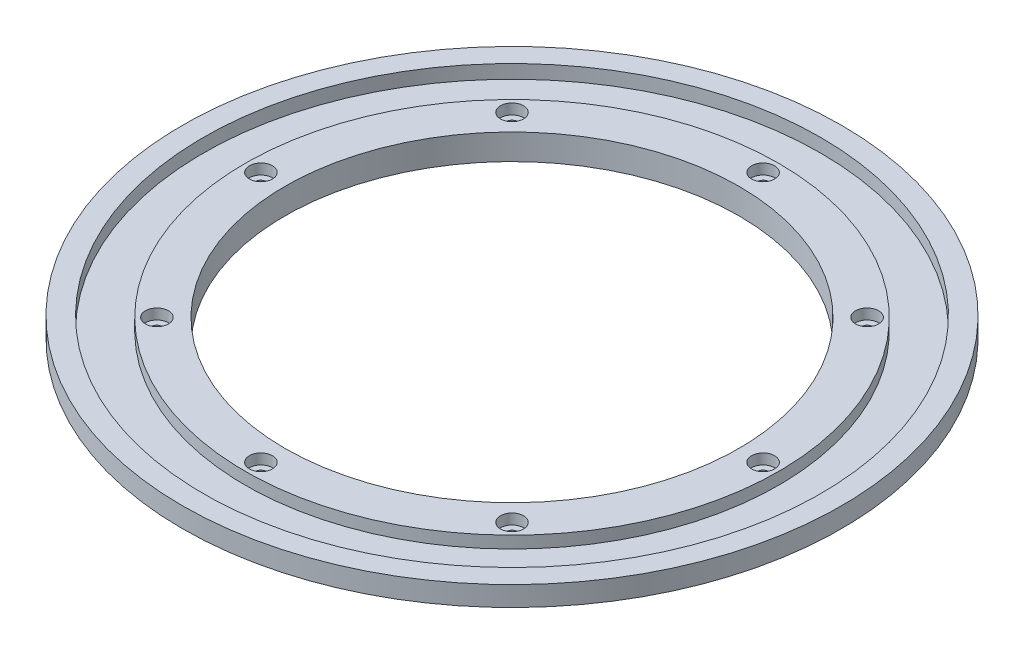
ISO-10303-21;
HEADER;
FILE_DESCRIPTION(('STEP AP214'),'2;1');
FILE_NAME('part.step','',(''),(''),'','','');
FILE_SCHEMA(('AUTOMOTIVE_DESIGN { 1 0 10303 214 1 1 1 1 }'));
ENDSEC;
DATA;
#1=APPLICATION_CONTEXT('core data for automotive mechanical design processes');
#2=APPLICATION_PROTOCOL_DEFINITION('international standard','automotive_design',2000,#1);
#3=PRODUCT_CONTEXT('',#1,'mechanical');
#4=PRODUCT('Part','Part','',(#3));
#5=PRODUCT_RELATED_PRODUCT_CATEGORY('part','',(#4));
#6=PRODUCT_DEFINITION_FORMATION('','',#4);
#7=PRODUCT_DEFINITION_CONTEXT('part definition',#1,'design');
#8=PRODUCT_DEFINITION('design','',#6,#7);
#9=PRODUCT_DEFINITION_SHAPE('','',#8);
#10=(LENGTH_UNIT() NAMED_UNIT(*) SI_UNIT(.MILLI.,.METRE.));
#11=(NAMED_UNIT(*) PLANE_ANGLE_UNIT() SI_UNIT($,.RADIAN.));
#12=(NAMED_UNIT(*) SI_UNIT($,.STERADIAN.) SOLID_ANGLE_UNIT());
#13=UNCERTAINTY_MEASURE_WITH_UNIT(LENGTH_MEASURE(1.E-05),#10,'distance_accuracy_value','');
#14=(GEOMETRIC_REPRESENTATION_CONTEXT(3) GLOBAL_UNCERTAINTY_ASSIGNED_CONTEXT((#13)) GLOBAL_UNIT_ASSIGNED_CONTEXT((#10,
#11,#12)) REPRESENTATION_CONTEXT('',''));
#15=CARTESIAN_POINT('',(0.,0.,0.));
#16=DIRECTION('',(0.,0.,1.));
#17=DIRECTION('',(1.,0.,0.));
#18=AXIS2_PLACEMENT_3D('',#15,#16,#17);
#19=CARTESIAN_POINT('',(-169.705627484764,8.71232876712426,-169.705627484752));
#20=DIRECTION('',(0.,1.,0.));
#21=DIRECTION('',(0.,0.,1.));
#22=AXIS2_PLACEMENT_3D('',#19,#20,#21);
#23=CYLINDRICAL_SURFACE('',#22,4.99999999999999);
#24=CARTESIAN_POINT('',(-169.705627484764,15.7123287671248,-169.705627484752));
#25=DIRECTION('',(0.,1.,0.));
#26=DIRECTION('',(0.,0.,1.));
#27=AXIS2_PLACEMENT_3D('',#24,#25,#26);
#28=CIRCLE('',#27,4.99999999999999);
#29=CARTESIAN_POINT('',(-169.705627484764,15.7123287671248,-164.705627484752));
#30=VERTEX_POINT('',#29);
#31=EDGE_CURVE('E56',#30,#30,#28,.T.);
#32=ORIENTED_EDGE('',*,*,#31,.F.);
#33=EDGE_LOOP('',(#32));
#34=FACE_BOUND('',#33,.T.);
#35=CARTESIAN_POINT('',(-169.705627484764,23.2123287671247,-169.705627484752));
#36=DIRECTION('',(0.,1.,0.));
#37=DIRECTION('',(0.,0.,1.));
#38=AXIS2_PLACEMENT_3D('',#35,#36,#37);
#39=CIRCLE('',#38,4.99999999999999);
#40=CARTESIAN_POINT('',(-169.705627484764,23.2123287671246,-164.705627484752));
#41=VERTEX_POINT('',#40);
#42=EDGE_CURVE('E41',#41,#41,#39,.F.);
#43=ORIENTED_EDGE('',*,*,#42,.F.);
#44=EDGE_LOOP('',(#43));
#45=FACE_BOUND('',#44,.T.);
#46=ADVANCED_FACE('F37',(#34,#45),#23,.F.);
#47=CARTESIAN_POINT('',(-239.999999999973,8.71232876712368,2.67328212068205E-11));
#48=DIRECTION('',(0.,1.,0.));
#49=DIRECTION('',(0.,0.,1.));
#50=AXIS2_PLACEMENT_3D('',#47,#48,#49);
#51=CYLINDRICAL_SURFACE('',#50,4.99999999999999);
#52=CARTESIAN_POINT('',(-239.999999999973,15.7123287671242,2.67568329498127E-11));
#53=DIRECTION('',(0.,1.,0.));
#54=DIRECTION('',(0.,0.,1.));
#55=AXIS2_PLACEMENT_3D('',#52,#53,#54);
#56=CIRCLE('',#55,4.99999999999999);
#57=CARTESIAN_POINT('',(-239.999999999973,15.7123287671242,5.00000000002675));
#58=VERTEX_POINT('',#57);
#59=EDGE_CURVE('E60',#58,#58,#56,.T.);
#60=ORIENTED_EDGE('',*,*,#59,.F.);
#61=EDGE_LOOP('',(#60));
#62=FACE_BOUND('',#61,.T.);
#63=CARTESIAN_POINT('',(-239.999999999973,23.2123287671241,2.67825598173044E-11));
#64=DIRECTION('',(0.,1.,0.));
#65=DIRECTION('',(0.,0.,1.));
#66=AXIS2_PLACEMENT_3D('',#63,#64,#65);
#67=CIRCLE('',#66,4.99999999999999);
#68=CARTESIAN_POINT('',(-239.999999999973,23.2123287671241,5.00000000002677));
#69=VERTEX_POINT('',#68);
#70=EDGE_CURVE('E113',#69,#69,#67,.F.);
#71=ORIENTED_EDGE('',*,*,#70,.F.);
#72=EDGE_LOOP('',(#71));
#73=FACE_BOUND('',#72,.T.);
#74=ADVANCED_FACE('F125',(#62,#73),#51,.F.);
#75=CARTESIAN_POINT('',(-169.705627484726,8.7123287671231,169.70562748479));
#76=DIRECTION('',(0.,1.,0.));
#77=DIRECTION('',(0.,0.,1.));
#78=AXIS2_PLACEMENT_3D('',#75,#76,#77);
#79=CYLINDRICAL_SURFACE('',#78,4.99999999999999);
#80=CARTESIAN_POINT('',(-169.705627484726,15.7123287671236,169.70562748479));
#81=DIRECTION('',(0.,1.,0.));
#82=DIRECTION('',(0.,0.,1.));
#83=AXIS2_PLACEMENT_3D('',#80,#81,#82);
#84=CIRCLE('',#83,4.99999999999999);
#85=CARTESIAN_POINT('',(-169.705627484726,15.7123287671236,174.70562748479));
#86=VERTEX_POINT('',#85);
#87=EDGE_CURVE('E64',#86,#86,#84,.T.);
#88=ORIENTED_EDGE('',*,*,#87,.F.);
#89=EDGE_LOOP('',(#88));
#90=FACE_BOUND('',#89,.T.);
#91=CARTESIAN_POINT('',(-169.705627484726,23.2123287671235,169.70562748479));
#92=DIRECTION('',(0.,1.,0.));
#93=DIRECTION('',(0.,0.,1.));
#94=AXIS2_PLACEMENT_3D('',#91,#92,#93);
#95=CIRCLE('',#94,4.99999999999999);
#96=CARTESIAN_POINT('',(-169.705627484726,23.2123287671235,174.70562748479));
#97=VERTEX_POINT('',#96);
#98=EDGE_CURVE('E110',#97,#97,#95,.F.);
#99=ORIENTED_EDGE('',*,*,#98,.F.);
#100=EDGE_LOOP('',(#99));
#101=FACE_BOUND('',#100,.T.);
#102=ADVANCED_FACE('F131',(#90,#101),#79,.F.);
#103=CARTESIAN_POINT('',(5.33470884532192E-11,8.71232876712285,240.));
#104=DIRECTION('',(0.,1.,0.));
#105=DIRECTION('',(0.,0.,1.));
#106=AXIS2_PLACEMENT_3D('',#103,#104,#105);
#107=CYLINDRICAL_SURFACE('',#106,5.);
#108=CARTESIAN_POINT('',(5.33470884532192E-11,15.7123287671234,240.));
#109=DIRECTION('',(0.,1.,0.));
#110=DIRECTION('',(0.,0.,1.));
#111=AXIS2_PLACEMENT_3D('',#108,#109,#110);
#112=CIRCLE('',#111,5.);
#113=CARTESIAN_POINT('',(5.33470884532192E-11,15.7123287671234,245.));
#114=VERTEX_POINT('',#113);
#115=EDGE_CURVE('E68',#114,#114,#112,.T.);
#116=ORIENTED_EDGE('',*,*,#115,.F.);
#117=EDGE_LOOP('',(#116));
#118=FACE_BOUND('',#117,.T.);
#119=CARTESIAN_POINT('',(5.33470884532192E-11,23.2123287671233,240.));
#120=DIRECTION('',(0.,1.,0.));
#121=DIRECTION('',(0.,0.,1.));
#122=AXIS2_PLACEMENT_3D('',#119,#120,#121);
#123=CIRCLE('',#122,5.);
#124=CARTESIAN_POINT('',(5.33470884532192E-11,23.2123287671232,245.));
#125=VERTEX_POINT('',#124);
#126=EDGE_CURVE('E106',#125,#125,#123,.F.);
#127=ORIENTED_EDGE('',*,*,#126,.F.);
#128=EDGE_LOOP('',(#127));
#129=FACE_BOUND('',#128,.T.);
#130=ADVANCED_FACE('F339',(#118,#129),#107,.F.);
#131=CARTESIAN_POINT('',(169.705627484817,8.7123287671231,169.705627484753));
#132=DIRECTION('',(0.,1.,0.));
#133=DIRECTION('',(0.,0.,1.));
#134=AXIS2_PLACEMENT_3D('',#131,#132,#133);
#135=CYLINDRICAL_SURFACE('',#134,4.99999999999999);
#136=CARTESIAN_POINT('',(169.705627484817,15.7123287671236,169.705627484753));
#137=DIRECTION('',(0.,1.,0.));
#138=DIRECTION('',(0.,0.,1.));
#139=AXIS2_PLACEMENT_3D('',#136,#137,#138);
#140=CIRCLE('',#139,4.99999999999999);
#141=CARTESIAN_POINT('',(169.705627484817,15.7123287671236,174.705627484753));
#142=VERTEX_POINT('',#141);
#143=EDGE_CURVE('E72',#142,#142,#140,.T.);
#144=ORIENTED_EDGE('',*,*,#143,.F.);
#145=EDGE_LOOP('',(#144));
#146=FACE_BOUND('',#145,.T.);
#147=CARTESIAN_POINT('',(169.705627484817,23.2123287671235,169.705627484753));
#148=DIRECTION('',(0.,1.,0.));
#149=DIRECTION('',(0.,0.,1.));
#150=AXIS2_PLACEMENT_3D('',#147,#148,#149);
#151=CIRCLE('',#150,4.99999999999999);
#152=CARTESIAN_POINT('',(169.705627484817,23.2123287671235,174.705627484753));
#153=VERTEX_POINT('',#152);
#154=EDGE_CURVE('E102',#153,#153,#151,.F.);
#155=ORIENTED_EDGE('',*,*,#154,.F.);
#156=EDGE_LOOP('',(#155));
#157=FACE_BOUND('',#156,.T.);
#158=ADVANCED_FACE('F335',(#146,#157),#135,.F.);
#159=CARTESIAN_POINT('',(240.000000000027,8.71232876712368,-2.66436587695782E-11));
#160=DIRECTION('',(0.,1.,0.));
#161=DIRECTION('',(0.,0.,1.));
#162=AXIS2_PLACEMENT_3D('',#159,#160,#161);
#163=CYLINDRICAL_SURFACE('',#162,4.99999999999999);
#164=CARTESIAN_POINT('',(240.000000000027,15.7123287671242,-2.6619647026586E-11));
#165=DIRECTION('',(0.,1.,0.));
#166=DIRECTION('',(0.,0.,1.));
#167=AXIS2_PLACEMENT_3D('',#164,#165,#166);
#168=CIRCLE('',#167,4.99999999999999);
#169=CARTESIAN_POINT('',(240.000000000027,15.7123287671242,4.99999999997337));
#170=VERTEX_POINT('',#169);
#171=EDGE_CURVE('E76',#170,#170,#168,.T.);
#172=ORIENTED_EDGE('',*,*,#171,.F.);
#173=EDGE_LOOP('',(#172));
#174=FACE_BOUND('',#173,.T.);
#175=CARTESIAN_POINT('',(240.000000000027,23.2123287671241,-2.65939201590944E-11));
#176=DIRECTION('',(0.,1.,0.));
#177=DIRECTION('',(0.,0.,1.));
#178=AXIS2_PLACEMENT_3D('',#175,#176,#177);
#179=CIRCLE('',#178,4.99999999999999);
#180=CARTESIAN_POINT('',(240.000000000027,23.2123287671241,4.9999999999734));
#181=VERTEX_POINT('',#180);
#182=EDGE_CURVE('E98',#181,#181,#179,.F.);
#183=ORIENTED_EDGE('',*,*,#182,.F.);
#184=EDGE_LOOP('',(#183));
#185=FACE_BOUND('',#184,.T.);
#186=ADVANCED_FACE('F331',(#174,#185),#163,.F.);
#187=CARTESIAN_POINT('',(169.705627484779,8.71232876712426,-169.70562748479));
#188=DIRECTION('',(0.,1.,0.));
#189=DIRECTION('',(0.,0.,1.));
#190=AXIS2_PLACEMENT_3D('',#187,#188,#189);
#191=CYLINDRICAL_SURFACE('',#190,4.99999999999999);
#192=CARTESIAN_POINT('',(169.705627484779,15.7123287671248,-169.70562748479));
#193=DIRECTION('',(0.,1.,0.));
#194=DIRECTION('',(0.,0.,1.));
#195=AXIS2_PLACEMENT_3D('',#192,#193,#194);
#196=CIRCLE('',#195,4.99999999999999);
#197=CARTESIAN_POINT('',(169.705627484779,15.7123287671248,-164.70562748479));
#198=VERTEX_POINT('',#197);
#199=EDGE_CURVE('E80',#198,#198,#196,.T.);
#200=ORIENTED_EDGE('',*,*,#199,.F.);
#201=EDGE_LOOP('',(#200));
#202=FACE_BOUND('',#201,.T.);
#203=CARTESIAN_POINT('',(169.705627484779,23.2123287671247,-169.70562748479));
#204=DIRECTION('',(0.,1.,0.));
#205=DIRECTION('',(0.,0.,1.));
#206=AXIS2_PLACEMENT_3D('',#203,#204,#205);
#207=CIRCLE('',#206,4.99999999999999);
#208=CARTESIAN_POINT('',(169.705627484779,23.2123287671246,-164.70562748479));
#209=VERTEX_POINT('',#208);
#210=EDGE_CURVE('E93',#209,#209,#207,.F.);
#211=ORIENTED_EDGE('',*,*,#210,.F.);
#212=EDGE_LOOP('',(#211));
#213=FACE_BOUND('',#212,.T.);
#214=ADVANCED_FACE('F327',(#202,#213),#191,.F.);
#215=CARTESIAN_POINT('',(0.,8.7123287671245,-240.));
#216=DIRECTION('',(0.,1.,0.));
#217=DIRECTION('',(0.,0.,1.));
#218=AXIS2_PLACEMENT_3D('',#215,#216,#217);
#219=CYLINDRICAL_SURFACE('',#218,5.);
#220=CARTESIAN_POINT('',(0.,15.712328767125,-240.));
#221=DIRECTION('',(0.,1.,0.));
#222=DIRECTION('',(0.,0.,1.));
#223=AXIS2_PLACEMENT_3D('',#220,#221,#222);
#224=CIRCLE('',#223,5.);
#225=CARTESIAN_POINT('',(0.,15.712328767125,-235.));
#226=VERTEX_POINT('',#225);
#227=EDGE_CURVE('E84',#226,#226,#224,.T.);
#228=ORIENTED_EDGE('',*,*,#227,.F.);
#229=EDGE_LOOP('',(#228));
#230=FACE_BOUND('',#229,.T.);
#231=CARTESIAN_POINT('',(0.,23.2123287671249,-240.));
#232=DIRECTION('',(0.,1.,0.));
#233=DIRECTION('',(0.,0.,1.));
#234=AXIS2_PLACEMENT_3D('',#231,#232,#233);
#235=CIRCLE('',#234,5.);
#236=CARTESIAN_POINT('',(0.,23.2123287671249,-235.));
#237=VERTEX_POINT('',#236);
#238=EDGE_CURVE('E89',#237,#237,#235,.F.);
#239=ORIENTED_EDGE('',*,*,#238,.F.);
#240=EDGE_LOOP('',(#239));
#241=FACE_BOUND('',#240,.T.);
#242=ADVANCED_FACE('F175',(#230,#241),#219,.F.);
#243=CARTESIAN_POINT('',(0.,-1465.13643598557,-5.02578279277057E-12));
#244=DIRECTION('',(0.,-1.,0.));
#245=DIRECTION('',(0.,0.,-1.));
#246=AXIS2_PLACEMENT_3D('',#243,#244,#245);
#247=CYLINDRICAL_SURFACE('',#246,314.999999999995);
#248=CARTESIAN_POINT('',(0.,15.7123287671244,0.));
#249=DIRECTION('',(0.,-1.,0.));
#250=DIRECTION('',(0.,0.,-1.));
#251=AXIS2_PLACEMENT_3D('',#248,#249,#250);
#252=CIRCLE('',#251,314.999999999995);
#253=CARTESIAN_POINT('',(0.,15.7123287671254,-314.999999999995));
#254=VERTEX_POINT('',#253);
#255=EDGE_CURVE('E88',#254,#254,#252,.T.);
#256=ORIENTED_EDGE('',*,*,#255,.F.);
#257=EDGE_LOOP('',(#256));
#258=FACE_BOUND('',#257,.T.);
#259=CARTESIAN_POINT('',(0.,34.7123287671243,1.19071931002422E-13));
#260=DIRECTION('',(0.,-1.,0.));
#261=DIRECTION('',(0.,0.,-1.));
#262=AXIS2_PLACEMENT_3D('',#259,#260,#261);
#263=CIRCLE('',#262,314.999999999995);
#264=CARTESIAN_POINT('',(0.,34.7123287671253,-314.999999999995));
#265=VERTEX_POINT('',#264);
#266=EDGE_CURVE('E10',#265,#265,#263,.T.);
#267=ORIENTED_EDGE('',*,*,#266,.T.);
#268=EDGE_LOOP('',(#267));
#269=FACE_BOUND('',#268,.T.);
#270=ADVANCED_FACE('F39',(#258,#269),#247,.T.);
#271=CARTESIAN_POINT('',(0.,34.7123287671232,314.999999999995));
#272=DIRECTION('',(0.,-1.,0.));
#273=DIRECTION('',(0.,0.,-1.));
#274=AXIS2_PLACEMENT_3D('',#271,#272,#273);
#275=PLANE('',#274);
#276=ORIENTED_EDGE('',*,*,#266,.F.);
#277=EDGE_LOOP('',(#276));
#278=FACE_BOUND('',#277,.T.);
#279=CARTESIAN_POINT('',(0.,34.7123287671243,1.19071931002422E-13));
#280=DIRECTION('',(0.,-1.,0.));
#281=DIRECTION('',(0.,0.,-1.));
#282=AXIS2_PLACEMENT_3D('',#279,#280,#281);
#283=CIRCLE('',#282,294.999999999995);
#284=CARTESIAN_POINT('',(0.,34.7123287671253,-294.999999999995));
#285=VERTEX_POINT('',#284);
#286=EDGE_CURVE('E46',#285,#285,#283,.T.);
#287=ORIENTED_EDGE('',*,*,#286,.T.);
#288=EDGE_LOOP('',(#287));
#289=FACE_BOUND('',#288,.T.);
#290=ADVANCED_FACE('F168',(#278,#289),#275,.F.);
#291=CARTESIAN_POINT('',(0.,-1465.13643598557,-5.02578279277057E-12));
#292=DIRECTION('',(0.,-1.,0.));
#293=DIRECTION('',(0.,0.,-1.));
#294=AXIS2_PLACEMENT_3D('',#291,#292,#293);
#295=CYLINDRICAL_SURFACE('',#294,294.999999999995);
#296=ORIENTED_EDGE('',*,*,#286,.F.);
#297=EDGE_LOOP('',(#296));
#298=FACE_BOUND('',#297,.T.);
#299=CARTESIAN_POINT('',(0.,21.7123287671244,0.));
#300=DIRECTION('',(0.,-1.,0.));
#301=DIRECTION('',(0.,0.,-1.));
#302=AXIS2_PLACEMENT_3D('',#299,#300,#301);
#303=CIRCLE('',#302,294.999999999995);
#304=CARTESIAN_POINT('',(0.,21.7123287671254,-294.999999999995));
#305=VERTEX_POINT('',#304);
#306=EDGE_CURVE('E52',#305,#305,#303,.T.);
#307=ORIENTED_EDGE('',*,*,#306,.T.);
#308=EDGE_LOOP('',(#307));
#309=FACE_BOUND('',#308,.T.);
#310=ADVANCED_FACE('F165',(#298,#309),#295,.F.);
#311=CARTESIAN_POINT('',(0.,21.7123287671232,294.999999999995));
#312=DIRECTION('',(0.,-1.,0.));
#313=DIRECTION('',(0.,0.,-1.));
#314=AXIS2_PLACEMENT_3D('',#311,#312,#313);
#315=PLANE('',#314);
#316=ORIENTED_EDGE('',*,*,#306,.F.);
#317=EDGE_LOOP('',(#316));
#318=FACE_BOUND('',#317,.T.);
#319=CARTESIAN_POINT('',(0.,21.7123287671241,0.));
#320=DIRECTION('',(0.,-1.,0.));
#321=DIRECTION('',(0.,0.,-1.));
#322=AXIS2_PLACEMENT_3D('',#319,#320,#321);
#323=CIRCLE('',#322,254.999999999995);
#324=CARTESIAN_POINT('',(0.,21.712328767125,-254.999999999995));
#325=VERTEX_POINT('',#324);
#326=EDGE_CURVE('E183',#325,#325,#323,.T.);
#327=ORIENTED_EDGE('',*,*,#326,.T.);
#328=EDGE_LOOP('',(#327));
#329=FACE_BOUND('',#328,.T.);
#330=ADVANCED_FACE('F161',(#318,#329),#315,.F.);
#331=CARTESIAN_POINT('',(0.,-1465.13643598557,-5.02578279277057E-12));
#332=DIRECTION('',(0.,-1.,0.));
#333=DIRECTION('',(0.,0.,-1.));
#334=AXIS2_PLACEMENT_3D('',#331,#332,#333);
#335=CYLINDRICAL_SURFACE('',#334,254.999999999995);
#336=ORIENTED_EDGE('',*,*,#326,.F.);
#337=EDGE_LOOP('',(#336));
#338=FACE_BOUND('',#337,.T.);
#339=CARTESIAN_POINT('',(0.,33.2123287671242,1.13926557504093E-13));
#340=DIRECTION('',(0.,-1.,0.));
#341=DIRECTION('',(0.,0.,-1.));
#342=AXIS2_PLACEMENT_3D('',#339,#340,#341);
#343=CIRCLE('',#342,254.999999999995);
#344=CARTESIAN_POINT('',(0.,33.2123287671251,-254.999999999995));
#345=VERTEX_POINT('',#344);
#346=EDGE_CURVE('E186',#345,#345,#343,.T.);
#347=ORIENTED_EDGE('',*,*,#346,.T.);
#348=EDGE_LOOP('',(#347));
#349=FACE_BOUND('',#348,.T.);
#350=ADVANCED_FACE('F157',(#338,#349),#335,.T.);
#351=CARTESIAN_POINT('',(0.,33.2123287671232,254.999999999995));
#352=DIRECTION('',(0.,-1.,0.));
#353=DIRECTION('',(0.,0.,-1.));
#354=AXIS2_PLACEMENT_3D('',#351,#352,#353);
#355=PLANE('',#354);
#356=CARTESIAN_POINT('',(0.,33.2123287671249,-240.));
#357=DIRECTION('',(0.,1.,0.));
#358=DIRECTION('',(0.,0.,1.));
#359=AXIS2_PLACEMENT_3D('',#356,#357,#358);
#360=CIRCLE('',#359,11.);
#361=CARTESIAN_POINT('',(0.,33.2123287671249,-229.));
#362=VERTEX_POINT('',#361);
#363=EDGE_CURVE('E267',#362,#362,#360,.T.);
#364=ORIENTED_EDGE('',*,*,#363,.F.);
#365=EDGE_LOOP('',(#364));
#366=FACE_BOUND('',#365,.T.);
#367=CARTESIAN_POINT('',(169.705627484777,33.2123287671247,-169.705627484786));
#368=DIRECTION('',(0.,1.,0.));
#369=DIRECTION('',(0.,0.,1.));
#370=AXIS2_PLACEMENT_3D('',#367,#368,#369);
#371=CIRCLE('',#370,11.0000000000019);
#372=CARTESIAN_POINT('',(169.705627484777,33.2123287671246,-158.705627484784));
#373=VERTEX_POINT('',#372);
#374=EDGE_CURVE('E259',#373,#373,#371,.T.);
#375=ORIENTED_EDGE('',*,*,#374,.F.);
#376=EDGE_LOOP('',(#375));
#377=FACE_BOUND('',#376,.T.);
#378=CARTESIAN_POINT('',(240.00000000002,33.2123287671241,-2.03056169476175E-11));
#379=DIRECTION('',(0.,1.,0.));
#380=DIRECTION('',(0.,0.,1.));
#381=AXIS2_PLACEMENT_3D('',#378,#379,#380);
#382=CIRCLE('',#381,11.0000000000144);
#383=CARTESIAN_POINT('',(240.00000000002,33.212328767124,10.9999999999941));
#384=VERTEX_POINT('',#383);
#385=EDGE_CURVE('E251',#384,#384,#382,.T.);
#386=ORIENTED_EDGE('',*,*,#385,.F.);
#387=EDGE_LOOP('',(#386));
#388=FACE_BOUND('',#387,.T.);
#389=CARTESIAN_POINT('',(169.705627484806,33.2123287671235,169.705627484757));
#390=DIRECTION('',(0.,1.,0.));
#391=DIRECTION('',(0.,0.,1.));
#392=AXIS2_PLACEMENT_3D('',#389,#390,#391);
#393=CIRCLE('',#392,11.0000000000303);
#394=CARTESIAN_POINT('',(169.705627484806,33.2123287671235,180.705627484787));
#395=VERTEX_POINT('',#394);
#396=EDGE_CURVE('E243',#395,#395,#393,.T.);
#397=ORIENTED_EDGE('',*,*,#396,.F.);
#398=EDGE_LOOP('',(#397));
#399=FACE_BOUND('',#398,.T.);
#400=CARTESIAN_POINT('',(4.08390870102432E-11,33.2123287671233,240.));
#401=DIRECTION('',(0.,1.,0.));
#402=DIRECTION('',(0.,0.,1.));
#403=AXIS2_PLACEMENT_3D('',#400,#401,#402);
#404=CIRCLE('',#403,11.0000000000407);
#405=CARTESIAN_POINT('',(4.08390870102432E-11,33.2123287671232,251.000000000041));
#406=VERTEX_POINT('',#405);
#407=EDGE_CURVE('E235',#406,#406,#404,.T.);
#408=ORIENTED_EDGE('',*,*,#407,.F.);
#409=EDGE_LOOP('',(#408));
#410=FACE_BOUND('',#409,.T.);
#411=CARTESIAN_POINT('',(-169.705627484737,33.2123287671235,169.705627484786));
#412=DIRECTION('',(0.,1.,0.));
#413=DIRECTION('',(0.,0.,1.));
#414=AXIS2_PLACEMENT_3D('',#411,#412,#413);
#415=CIRCLE('',#414,11.0000000000396);
#416=CARTESIAN_POINT('',(-169.705627484737,33.2123287671235,180.705627484826));
#417=VERTEX_POINT('',#416);
#418=EDGE_CURVE('E227',#417,#417,#415,.T.);
#419=ORIENTED_EDGE('',*,*,#418,.F.);
#420=EDGE_LOOP('',(#419));
#421=FACE_BOUND('',#420,.T.);
#422=CARTESIAN_POINT('',(-239.99999999998,33.2123287671241,2.05628615858052E-11));
#423=DIRECTION('',(0.,1.,0.));
#424=DIRECTION('',(0.,0.,1.));
#425=AXIS2_PLACEMENT_3D('',#422,#423,#424);
#426=CIRCLE('',#425,11.0000000000279);
#427=CARTESIAN_POINT('',(-239.99999999998,33.212328767124,11.0000000000485));
#428=VERTEX_POINT('',#427);
#429=EDGE_CURVE('E219',#428,#428,#426,.T.);
#430=ORIENTED_EDGE('',*,*,#429,.F.);
#431=EDGE_LOOP('',(#430));
#432=FACE_BOUND('',#431,.T.);
#433=CARTESIAN_POINT('',(-169.705627484765,33.2123287671247,-169.705627484757));
#434=DIRECTION('',(0.,1.,0.));
#435=DIRECTION('',(0.,0.,1.));
#436=AXIS2_PLACEMENT_3D('',#433,#434,#435);
#437=CIRCLE('',#436,11.0000000000128);
#438=CARTESIAN_POINT('',(-169.705627484765,33.2123287671246,-158.705627484744));
#439=VERTEX_POINT('',#438);
#440=EDGE_CURVE('E211',#439,#439,#437,.T.);
#441=ORIENTED_EDGE('',*,*,#440,.F.);
#442=EDGE_LOOP('',(#441));
#443=FACE_BOUND('',#442,.T.);
#444=ORIENTED_EDGE('',*,*,#346,.F.);
#445=EDGE_LOOP('',(#444));
#446=FACE_BOUND('',#445,.T.);
#447=CARTESIAN_POINT('',(0.,33.212328767124,1.13926557504092E-13));
#448=DIRECTION('',(0.,-1.,0.));
#449=DIRECTION('',(0.,0.,-1.));
#450=AXIS2_PLACEMENT_3D('',#447,#448,#449);
#451=CIRCLE('',#450,216.999999999995);
#452=CARTESIAN_POINT('',(0.,33.2123287671247,-216.999999999995));
#453=VERTEX_POINT('',#452);
#454=EDGE_CURVE('E192',#453,#453,#451,.T.);
#455=ORIENTED_EDGE('',*,*,#454,.T.);
#456=EDGE_LOOP('',(#455));
#457=FACE_BOUND('',#456,.T.);
#458=ADVANCED_FACE('F153',(#366,#377,#388,#399,#410,#421,#432,#443,#446,#457),#355,.F.);
#459=CARTESIAN_POINT('',(0.,-1465.13643598557,-5.02578279277057E-12));
#460=DIRECTION('',(0.,-1.,0.));
#461=DIRECTION('',(0.,0.,-1.));
#462=AXIS2_PLACEMENT_3D('',#459,#460,#461);
#463=CYLINDRICAL_SURFACE('',#462,216.999999999995);
#464=ORIENTED_EDGE('',*,*,#454,.F.);
#465=EDGE_LOOP('',(#464));
#466=FACE_BOUND('',#465,.T.);
#467=CARTESIAN_POINT('',(0.,8.71232876712402,0.));
#468=DIRECTION('',(0.,-1.,0.));
#469=DIRECTION('',(0.,0.,-1.));
#470=AXIS2_PLACEMENT_3D('',#467,#468,#469);
#471=CIRCLE('',#470,216.999999999995);
#472=CARTESIAN_POINT('',(0.,8.71232876712477,-216.999999999995));
#473=VERTEX_POINT('',#472);
#474=EDGE_CURVE('E196',#473,#473,#471,.T.);
#475=ORIENTED_EDGE('',*,*,#474,.T.);
#476=EDGE_LOOP('',(#475));
#477=FACE_BOUND('',#476,.T.);
#478=ADVANCED_FACE('F149',(#466,#477),#463,.F.);
#479=CARTESIAN_POINT('',(0.,8.71232876712329,216.999999999995));
#480=DIRECTION('',(0.,1.,0.));
#481=DIRECTION('',(0.,0.,1.));
#482=AXIS2_PLACEMENT_3D('',#479,#480,#481);
#483=PLANE('',#482);
#484=ORIENTED_EDGE('',*,*,#474,.F.);
#485=EDGE_LOOP('',(#484));
#486=FACE_BOUND('',#485,.T.);
#487=CARTESIAN_POINT('',(0.,8.71232876712424,0.));
#488=DIRECTION('',(0.,-1.,0.));
#489=DIRECTION('',(0.,0.,-1.));
#490=AXIS2_PLACEMENT_3D('',#487,#488,#489);
#491=CIRCLE('',#490,228.999999999995);
#492=CARTESIAN_POINT('',(0.,8.71232876712503,-228.999999999995));
#493=VERTEX_POINT('',#492);
#494=EDGE_CURVE('E200',#493,#493,#491,.T.);
#495=ORIENTED_EDGE('',*,*,#494,.T.);
#496=EDGE_LOOP('',(#495));
#497=FACE_BOUND('',#496,.T.);
#498=ADVANCED_FACE('F145',(#486,#497),#483,.F.);
#499=CARTESIAN_POINT('',(0.,-1465.13643598557,-5.02578279277057E-12));
#500=DIRECTION('',(0.,-1.,0.));
#501=DIRECTION('',(0.,0.,-1.));
#502=AXIS2_PLACEMENT_3D('',#499,#500,#501);
#503=CYLINDRICAL_SURFACE('',#502,228.999999999995);
#504=ORIENTED_EDGE('',*,*,#494,.F.);
#505=EDGE_LOOP('',(#504));
#506=FACE_BOUND('',#505,.T.);
#507=CARTESIAN_POINT('',(0.,15.7123287671241,0.));
#508=DIRECTION('',(0.,-1.,0.));
#509=DIRECTION('',(0.,0.,-1.));
#510=AXIS2_PLACEMENT_3D('',#507,#508,#509);
#511=CIRCLE('',#510,228.999999999995);
#512=CARTESIAN_POINT('',(0.,15.7123287671249,-228.999999999995));
#513=VERTEX_POINT('',#512);
#514=EDGE_CURVE('E204',#513,#513,#511,.T.);
#515=ORIENTED_EDGE('',*,*,#514,.T.);
#516=EDGE_LOOP('',(#515));
#517=FACE_BOUND('',#516,.T.);
#518=ADVANCED_FACE('F141',(#506,#517),#503,.T.);
#519=CARTESIAN_POINT('',(0.,15.7123287671234,228.999999999995));
#520=DIRECTION('',(0.,1.,0.));
#521=DIRECTION('',(0.,0.,1.));
#522=AXIS2_PLACEMENT_3D('',#519,#520,#521);
#523=PLANE('',#522);
#524=ORIENTED_EDGE('',*,*,#227,.T.);
#525=EDGE_LOOP('',(#524));
#526=FACE_BOUND('',#525,.T.);
#527=ORIENTED_EDGE('',*,*,#199,.T.);
#528=EDGE_LOOP('',(#527));
#529=FACE_BOUND('',#528,.T.);
#530=ORIENTED_EDGE('',*,*,#171,.T.);
#531=EDGE_LOOP('',(#530));
#532=FACE_BOUND('',#531,.T.);
#533=ORIENTED_EDGE('',*,*,#143,.T.);
#534=EDGE_LOOP('',(#533));
#535=FACE_BOUND('',#534,.T.);
#536=ORIENTED_EDGE('',*,*,#115,.T.);
#537=EDGE_LOOP('',(#536));
#538=FACE_BOUND('',#537,.T.);
#539=ORIENTED_EDGE('',*,*,#87,.T.);
#540=EDGE_LOOP('',(#539));
#541=FACE_BOUND('',#540,.T.);
#542=ORIENTED_EDGE('',*,*,#59,.T.);
#543=EDGE_LOOP('',(#542));
#544=FACE_BOUND('',#543,.T.);
#545=ORIENTED_EDGE('',*,*,#31,.T.);
#546=EDGE_LOOP('',(#545));
#547=FACE_BOUND('',#546,.T.);
#548=ORIENTED_EDGE('',*,*,#514,.F.);
#549=EDGE_LOOP('',(#548));
#550=FACE_BOUND('',#549,.T.);
#551=ORIENTED_EDGE('',*,*,#255,.T.);
#552=EDGE_LOOP('',(#551));
#553=FACE_BOUND('',#552,.T.);
#554=ADVANCED_FACE('F137',(#526,#529,#532,#535,#538,#541,#544,#547,#550,#553),#523,.F.);
#555=CARTESIAN_POINT('',(0.,23.2123287671249,-240.));
#556=DIRECTION('',(0.,1.,0.));
#557=DIRECTION('',(0.,0.,1.));
#558=AXIS2_PLACEMENT_3D('',#555,#556,#557);
#559=PLANE('',#558);
#560=CARTESIAN_POINT('',(0.,23.2123287671249,-240.));
#561=DIRECTION('',(0.,1.,0.));
#562=DIRECTION('',(0.,0.,1.));
#563=AXIS2_PLACEMENT_3D('',#560,#561,#562);
#564=CIRCLE('',#563,11.);
#565=CARTESIAN_POINT('',(0.,23.2123287671249,-229.));
#566=VERTEX_POINT('',#565);
#567=EDGE_CURVE('E94',#566,#566,#564,.T.);
#568=ORIENTED_EDGE('',*,*,#567,.T.);
#569=EDGE_LOOP('',(#568));
#570=FACE_BOUND('',#569,.T.);
#571=ORIENTED_EDGE('',*,*,#238,.T.);
#572=EDGE_LOOP('',(#571));
#573=FACE_BOUND('',#572,.T.);
#574=ADVANCED_FACE('F140',(#570,#573),#559,.T.);
#575=CARTESIAN_POINT('',(0.,23.2123287671249,-240.));
#576=DIRECTION('',(0.,1.,0.));
#577=DIRECTION('',(0.,0.,1.));
#578=AXIS2_PLACEMENT_3D('',#575,#576,#577);
#579=CYLINDRICAL_SURFACE('',#578,11.);
#580=ORIENTED_EDGE('',*,*,#567,.F.);
#581=EDGE_LOOP('',(#580));
#582=FACE_BOUND('',#581,.T.);
#583=ORIENTED_EDGE('',*,*,#363,.T.);
#584=EDGE_LOOP('',(#583));
#585=FACE_BOUND('',#584,.T.);
#586=ADVANCED_FACE('F277',(#582,#585),#579,.F.);
#587=CARTESIAN_POINT('',(169.705627484777,23.2123287671247,-169.705627484786));
#588=DIRECTION('',(0.,1.,0.));
#589=DIRECTION('',(0.,0.,1.));
#590=AXIS2_PLACEMENT_3D('',#587,#588,#589);
#591=PLANE('',#590);
#592=CARTESIAN_POINT('',(169.705627484777,23.2123287671247,-169.705627484786));
#593=DIRECTION('',(0.,1.,0.));
#594=DIRECTION('',(0.,0.,1.));
#595=AXIS2_PLACEMENT_3D('',#592,#593,#594);
#596=CIRCLE('',#595,11.0000000000019);
#597=CARTESIAN_POINT('',(169.705627484777,23.2123287671246,-158.705627484784));
#598=VERTEX_POINT('',#597);
#599=EDGE_CURVE('E263',#598,#598,#596,.T.);
#600=ORIENTED_EDGE('',*,*,#599,.T.);
#601=EDGE_LOOP('',(#600));
#602=FACE_BOUND('',#601,.T.);
#603=ORIENTED_EDGE('',*,*,#210,.T.);
#604=EDGE_LOOP('',(#603));
#605=FACE_BOUND('',#604,.T.);
#606=ADVANCED_FACE('F280',(#602,#605),#591,.T.);
#607=CARTESIAN_POINT('',(169.705627484777,23.2123287671247,-169.705627484786));
#608=DIRECTION('',(0.,1.,0.));
#609=DIRECTION('',(0.,0.,1.));
#610=AXIS2_PLACEMENT_3D('',#607,#608,#609);
#611=CYLINDRICAL_SURFACE('',#610,11.0000000000019);
#612=ORIENTED_EDGE('',*,*,#599,.F.);
#613=EDGE_LOOP('',(#612));
#614=FACE_BOUND('',#613,.T.);
#615=ORIENTED_EDGE('',*,*,#374,.T.);
#616=EDGE_LOOP('',(#615));
#617=FACE_BOUND('',#616,.T.);
#618=ADVANCED_FACE('F452',(#614,#617),#611,.F.);
#619=CARTESIAN_POINT('',(240.00000000002,23.2123287671241,-2.03399194376063E-11));
#620=DIRECTION('',(0.,1.,0.));
#621=DIRECTION('',(0.,0.,1.));
#622=AXIS2_PLACEMENT_3D('',#619,#620,#621);
#623=PLANE('',#622);
#624=CARTESIAN_POINT('',(240.00000000002,23.2123287671241,-2.03399194376063E-11));
#625=DIRECTION('',(0.,1.,0.));
#626=DIRECTION('',(0.,0.,1.));
#627=AXIS2_PLACEMENT_3D('',#624,#625,#626);
#628=CIRCLE('',#627,11.0000000000144);
#629=CARTESIAN_POINT('',(240.00000000002,23.212328767124,10.999999999994));
#630=VERTEX_POINT('',#629);
#631=EDGE_CURVE('E255',#630,#630,#628,.T.);
#632=ORIENTED_EDGE('',*,*,#631,.T.);
#633=EDGE_LOOP('',(#632));
#634=FACE_BOUND('',#633,.T.);
#635=ORIENTED_EDGE('',*,*,#182,.T.);
#636=EDGE_LOOP('',(#635));
#637=FACE_BOUND('',#636,.T.);
#638=ADVANCED_FACE('F443',(#634,#637),#623,.T.);
#639=CARTESIAN_POINT('',(240.00000000002,23.2123287671241,-2.03399194376063E-11));
#640=DIRECTION('',(0.,1.,0.));
#641=DIRECTION('',(0.,0.,1.));
#642=AXIS2_PLACEMENT_3D('',#639,#640,#641);
#643=CYLINDRICAL_SURFACE('',#642,11.0000000000144);
#644=ORIENTED_EDGE('',*,*,#631,.F.);
#645=EDGE_LOOP('',(#644));
#646=FACE_BOUND('',#645,.T.);
#647=ORIENTED_EDGE('',*,*,#385,.T.);
#648=EDGE_LOOP('',(#647));
#649=FACE_BOUND('',#648,.T.);
#650=ADVANCED_FACE('F434',(#646,#649),#643,.F.);
#651=CARTESIAN_POINT('',(169.705627484806,23.2123287671235,169.705627484757));
#652=DIRECTION('',(0.,1.,0.));
#653=DIRECTION('',(0.,0.,1.));
#654=AXIS2_PLACEMENT_3D('',#651,#652,#653);
#655=PLANE('',#654);
#656=CARTESIAN_POINT('',(169.705627484806,23.2123287671235,169.705627484757));
#657=DIRECTION('',(0.,1.,0.));
#658=DIRECTION('',(0.,0.,1.));
#659=AXIS2_PLACEMENT_3D('',#656,#657,#658);
#660=CIRCLE('',#659,11.0000000000303);
#661=CARTESIAN_POINT('',(169.705627484806,23.2123287671235,180.705627484787));
#662=VERTEX_POINT('',#661);
#663=EDGE_CURVE('E247',#662,#662,#660,.T.);
#664=ORIENTED_EDGE('',*,*,#663,.T.);
#665=EDGE_LOOP('',(#664));
#666=FACE_BOUND('',#665,.T.);
#667=ORIENTED_EDGE('',*,*,#154,.T.);
#668=EDGE_LOOP('',(#667));
#669=FACE_BOUND('',#668,.T.);
#670=ADVANCED_FACE('F425',(#666,#669),#655,.T.);
#671=CARTESIAN_POINT('',(169.705627484806,23.2123287671235,169.705627484757));
#672=DIRECTION('',(0.,1.,0.));
#673=DIRECTION('',(0.,0.,1.));
#674=AXIS2_PLACEMENT_3D('',#671,#672,#673);
#675=CYLINDRICAL_SURFACE('',#674,11.0000000000303);
#676=ORIENTED_EDGE('',*,*,#663,.F.);
#677=EDGE_LOOP('',(#676));
#678=FACE_BOUND('',#677,.T.);
#679=ORIENTED_EDGE('',*,*,#396,.T.);
#680=EDGE_LOOP('',(#679));
#681=FACE_BOUND('',#680,.T.);
#682=ADVANCED_FACE('F417',(#678,#681),#675,.F.);
#683=CARTESIAN_POINT('',(4.08390870102432E-11,23.2123287671233,240.));
#684=DIRECTION('',(0.,1.,0.));
#685=DIRECTION('',(0.,0.,1.));
#686=AXIS2_PLACEMENT_3D('',#683,#684,#685);
#687=PLANE('',#686);
#688=CARTESIAN_POINT('',(4.08390870102432E-11,23.2123287671233,240.));
#689=DIRECTION('',(0.,1.,0.));
#690=DIRECTION('',(0.,0.,1.));
#691=AXIS2_PLACEMENT_3D('',#688,#689,#690);
#692=CIRCLE('',#691,11.0000000000407);
#693=CARTESIAN_POINT('',(4.08390870102432E-11,23.2123287671232,251.000000000041));
#694=VERTEX_POINT('',#693);
#695=EDGE_CURVE('E239',#694,#694,#692,.T.);
#696=ORIENTED_EDGE('',*,*,#695,.T.);
#697=EDGE_LOOP('',(#696));
#698=FACE_BOUND('',#697,.T.);
#699=ORIENTED_EDGE('',*,*,#126,.T.);
#700=EDGE_LOOP('',(#699));
#701=FACE_BOUND('',#700,.T.);
#702=ADVANCED_FACE('F364',(#698,#701),#687,.T.);
#703=CARTESIAN_POINT('',(4.08390870102432E-11,23.2123287671233,240.));
#704=DIRECTION('',(0.,1.,0.));
#705=DIRECTION('',(0.,0.,1.));
#706=AXIS2_PLACEMENT_3D('',#703,#704,#705);
#707=CYLINDRICAL_SURFACE('',#706,11.0000000000407);
#708=ORIENTED_EDGE('',*,*,#695,.F.);
#709=EDGE_LOOP('',(#708));
#710=FACE_BOUND('',#709,.T.);
#711=ORIENTED_EDGE('',*,*,#407,.T.);
#712=EDGE_LOOP('',(#711));
#713=FACE_BOUND('',#712,.T.);
#714=ADVANCED_FACE('F354',(#710,#713),#707,.F.);
#715=CARTESIAN_POINT('',(-169.705627484737,23.2123287671235,169.705627484786));
#716=DIRECTION('',(0.,1.,0.));
#717=DIRECTION('',(0.,0.,1.));
#718=AXIS2_PLACEMENT_3D('',#715,#716,#717);
#719=PLANE('',#718);
#720=CARTESIAN_POINT('',(-169.705627484737,23.2123287671235,169.705627484786));
#721=DIRECTION('',(0.,1.,0.));
#722=DIRECTION('',(0.,0.,1.));
#723=AXIS2_PLACEMENT_3D('',#720,#721,#722);
#724=CIRCLE('',#723,11.0000000000396);
#725=CARTESIAN_POINT('',(-169.705627484737,23.2123287671235,180.705627484826));
#726=VERTEX_POINT('',#725);
#727=EDGE_CURVE('E231',#726,#726,#724,.T.);
#728=ORIENTED_EDGE('',*,*,#727,.T.);
#729=EDGE_LOOP('',(#728));
#730=FACE_BOUND('',#729,.T.);
#731=ORIENTED_EDGE('',*,*,#98,.T.);
#732=EDGE_LOOP('',(#731));
#733=FACE_BOUND('',#732,.T.);
#734=ADVANCED_FACE('F351',(#730,#733),#719,.T.);
#735=CARTESIAN_POINT('',(-169.705627484737,23.2123287671235,169.705627484786));
#736=DIRECTION('',(0.,1.,0.));
#737=DIRECTION('',(0.,0.,1.));
#738=AXIS2_PLACEMENT_3D('',#735,#736,#737);
#739=CYLINDRICAL_SURFACE('',#738,11.0000000000396);
#740=ORIENTED_EDGE('',*,*,#727,.F.);
#741=EDGE_LOOP('',(#740));
#742=FACE_BOUND('',#741,.T.);
#743=ORIENTED_EDGE('',*,*,#418,.T.);
#744=EDGE_LOOP('',(#743));
#745=FACE_BOUND('',#744,.T.);
#746=ADVANCED_FACE('F353',(#742,#745),#739,.F.);
#747=CARTESIAN_POINT('',(-239.99999999998,23.2123287671241,2.05285590958163E-11));
#748=DIRECTION('',(0.,1.,0.));
#749=DIRECTION('',(0.,0.,1.));
#750=AXIS2_PLACEMENT_3D('',#747,#748,#749);
#751=PLANE('',#750);
#752=CARTESIAN_POINT('',(-239.99999999998,23.2123287671241,2.05285590958163E-11));
#753=DIRECTION('',(0.,1.,0.));
#754=DIRECTION('',(0.,0.,1.));
#755=AXIS2_PLACEMENT_3D('',#752,#753,#754);
#756=CIRCLE('',#755,11.0000000000279);
#757=CARTESIAN_POINT('',(-239.99999999998,23.212328767124,11.0000000000485));
#758=VERTEX_POINT('',#757);
#759=EDGE_CURVE('E223',#758,#758,#756,.T.);
#760=ORIENTED_EDGE('',*,*,#759,.T.);
#761=EDGE_LOOP('',(#760));
#762=FACE_BOUND('',#761,.T.);
#763=ORIENTED_EDGE('',*,*,#70,.T.);
#764=EDGE_LOOP('',(#763));
#765=FACE_BOUND('',#764,.T.);
#766=ADVANCED_FACE('F361',(#762,#765),#751,.T.);
#767=CARTESIAN_POINT('',(-239.99999999998,23.2123287671241,2.05285590958163E-11));
#768=DIRECTION('',(0.,1.,0.));
#769=DIRECTION('',(0.,0.,1.));
#770=AXIS2_PLACEMENT_3D('',#767,#768,#769);
#771=CYLINDRICAL_SURFACE('',#770,11.0000000000279);
#772=ORIENTED_EDGE('',*,*,#759,.F.);
#773=EDGE_LOOP('',(#772));
#774=FACE_BOUND('',#773,.T.);
#775=ORIENTED_EDGE('',*,*,#429,.T.);
#776=EDGE_LOOP('',(#775));
#777=FACE_BOUND('',#776,.T.);
#778=ADVANCED_FACE('F319',(#774,#777),#771,.F.);
#779=CARTESIAN_POINT('',(-169.705627484765,23.2123287671247,-169.705627484757));
#780=DIRECTION('',(0.,1.,0.));
#781=DIRECTION('',(0.,0.,1.));
#782=AXIS2_PLACEMENT_3D('',#779,#780,#781);
#783=PLANE('',#782);
#784=CARTESIAN_POINT('',(-169.705627484765,23.2123287671247,-169.705627484757));
#785=DIRECTION('',(0.,1.,0.));
#786=DIRECTION('',(0.,0.,1.));
#787=AXIS2_PLACEMENT_3D('',#784,#785,#786);
#788=CIRCLE('',#787,11.0000000000128);
#789=CARTESIAN_POINT('',(-169.705627484765,23.2123287671246,-158.705627484744));
#790=VERTEX_POINT('',#789);
#791=EDGE_CURVE('E215',#790,#790,#788,.T.);
#792=ORIENTED_EDGE('',*,*,#791,.T.);
#793=EDGE_LOOP('',(#792));
#794=FACE_BOUND('',#793,.T.);
#795=ORIENTED_EDGE('',*,*,#42,.T.);
#796=EDGE_LOOP('',(#795));
#797=FACE_BOUND('',#796,.T.);
#798=ADVANCED_FACE('F122',(#794,#797),#783,.T.);
#799=CARTESIAN_POINT('',(-169.705627484765,23.2123287671247,-169.705627484757));
#800=DIRECTION('',(0.,1.,0.));
#801=DIRECTION('',(0.,0.,1.));
#802=AXIS2_PLACEMENT_3D('',#799,#800,#801);
#803=CYLINDRICAL_SURFACE('',#802,11.0000000000128);
#804=ORIENTED_EDGE('',*,*,#791,.F.);
#805=EDGE_LOOP('',(#804));
#806=FACE_BOUND('',#805,.T.);
#807=ORIENTED_EDGE('',*,*,#440,.T.);
#808=EDGE_LOOP('',(#807));
#809=FACE_BOUND('',#808,.T.);
#810=ADVANCED_FACE('F312',(#806,#809),#803,.F.);
#811=CLOSED_SHELL('',(#46,#74,#102,#130,#158,#186,#214,#242,#270,#290,#310,#330,#350,#458,#478,
#498,#518,#554,#574,#586,#606,#618,#638,#650,#670,#682,#702,#714,#734,#746,#766,#778,#798,#810));
#812=MANIFOLD_SOLID_BREP('B2',#811);
#813=ADVANCED_BREP_SHAPE_REPRESENTATION('',(#18,#812),#14);
#814=SHAPE_DEFINITION_REPRESENTATION(#9,#813);
ENDSEC;
END-ISO-10303-21;
